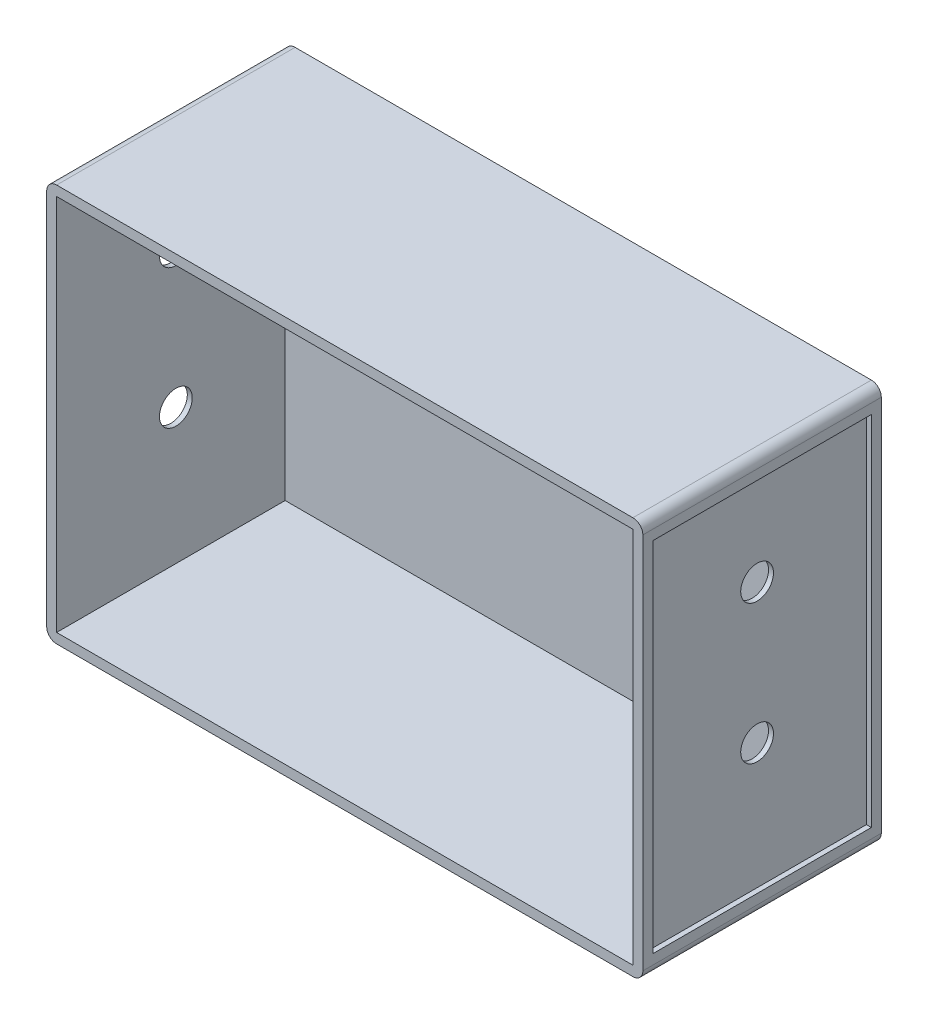
ISO-10303-21;
HEADER;
FILE_DESCRIPTION(('STEP AP214'),'2;1');
FILE_NAME('part.step','',(''),(''),'','','');
FILE_SCHEMA(('AUTOMOTIVE_DESIGN { 1 0 10303 214 1 1 1 1 }'));
ENDSEC;
DATA;
#1=APPLICATION_CONTEXT('core data for automotive mechanical design processes');
#2=APPLICATION_PROTOCOL_DEFINITION('international standard','automotive_design',2000,#1);
#3=PRODUCT_CONTEXT('',#1,'mechanical');
#4=PRODUCT('Part','Part','',(#3));
#5=PRODUCT_RELATED_PRODUCT_CATEGORY('part','',(#4));
#6=PRODUCT_DEFINITION_FORMATION('','',#4);
#7=PRODUCT_DEFINITION_CONTEXT('part definition',#1,'design');
#8=PRODUCT_DEFINITION('design','',#6,#7);
#9=PRODUCT_DEFINITION_SHAPE('','',#8);
#10=(LENGTH_UNIT() NAMED_UNIT(*) SI_UNIT(.MILLI.,.METRE.));
#11=(NAMED_UNIT(*) PLANE_ANGLE_UNIT() SI_UNIT($,.RADIAN.));
#12=(NAMED_UNIT(*) SI_UNIT($,.STERADIAN.) SOLID_ANGLE_UNIT());
#13=UNCERTAINTY_MEASURE_WITH_UNIT(LENGTH_MEASURE(1.E-05),#10,'distance_accuracy_value','');
#14=(GEOMETRIC_REPRESENTATION_CONTEXT(3) GLOBAL_UNCERTAINTY_ASSIGNED_CONTEXT((#13)) GLOBAL_UNIT_ASSIGNED_CONTEXT((#10,
#11,#12)) REPRESENTATION_CONTEXT('',''));
#15=CARTESIAN_POINT('',(0.,0.,0.));
#16=DIRECTION('',(0.,0.,1.));
#17=DIRECTION('',(1.,0.,0.));
#18=AXIS2_PLACEMENT_3D('',#15,#16,#17);
#19=CARTESIAN_POINT('',(150.,100.,60.));
#20=DIRECTION('',(-1.,0.,0.));
#21=DIRECTION('',(0.,-1.,0.));
#22=AXIS2_PLACEMENT_3D('',#19,#20,#21);
#23=PLANE('',#22);
#24=DIRECTION('',(0.,-1.,0.));
#25=VECTOR('',#24,1.);
#26=CARTESIAN_POINT('',(150.,90.,55.));
#27=LINE('',#26,#25);
#28=CARTESIAN_POINT('',(150.,90.,55.));
#29=VERTEX_POINT('',#28);
#30=CARTESIAN_POINT('',(150.,-90.,55.));
#31=VERTEX_POINT('',#30);
#32=EDGE_CURVE('E249',#29,#31,#27,.T.);
#33=ORIENTED_EDGE('',*,*,#32,.F.);
#34=DIRECTION('',(0.,0.,1.));
#35=VECTOR('',#34,1.);
#36=CARTESIAN_POINT('',(150.,90.,-55.));
#37=LINE('',#36,#35);
#38=CARTESIAN_POINT('',(150.,90.,-55.));
#39=VERTEX_POINT('',#38);
#40=EDGE_CURVE('E63',#39,#29,#37,.T.);
#41=ORIENTED_EDGE('',*,*,#40,.F.);
#42=DIRECTION('',(0.,1.,0.));
#43=VECTOR('',#42,1.);
#44=CARTESIAN_POINT('',(150.,-90.,-55.));
#45=LINE('',#44,#43);
#46=CARTESIAN_POINT('',(150.,-90.,-55.));
#47=VERTEX_POINT('',#46);
#48=EDGE_CURVE('E234',#47,#39,#45,.T.);
#49=ORIENTED_EDGE('',*,*,#48,.F.);
#50=DIRECTION('',(0.,0.,-1.));
#51=VECTOR('',#50,1.);
#52=CARTESIAN_POINT('',(150.,-90.,55.));
#53=LINE('',#52,#51);
#54=EDGE_CURVE('E253',#31,#47,#53,.T.);
#55=ORIENTED_EDGE('',*,*,#54,.F.);
#56=EDGE_LOOP('',(#33,#41,#49,#55));
#57=FACE_BOUND('',#56,.T.);
#58=DIRECTION('',(0.,1.,0.));
#59=VECTOR('',#58,1.);
#60=CARTESIAN_POINT('',(150.,100.,60.));
#61=LINE('',#60,#59);
#62=CARTESIAN_POINT('',(150.,-95.,60.));
#63=VERTEX_POINT('',#62);
#64=CARTESIAN_POINT('',(150.,95.,60.));
#65=VERTEX_POINT('',#64);
#66=EDGE_CURVE('E312',#63,#65,#61,.T.);
#67=ORIENTED_EDGE('',*,*,#66,.F.);
#68=DIRECTION('',(0.,0.,-1.));
#69=VECTOR('',#68,1.);
#70=CARTESIAN_POINT('',(150.,-95.,60.));
#71=LINE('',#70,#69);
#72=CARTESIAN_POINT('',(150.,-95.,-60.));
#73=VERTEX_POINT('',#72);
#74=EDGE_CURVE('E346',#63,#73,#71,.T.);
#75=ORIENTED_EDGE('',*,*,#74,.T.);
#76=DIRECTION('',(0.,1.,0.));
#77=VECTOR('',#76,1.);
#78=CARTESIAN_POINT('',(150.,100.,-60.));
#79=LINE('',#78,#77);
#80=CARTESIAN_POINT('',(150.,95.,-60.));
#81=VERTEX_POINT('',#80);
#82=EDGE_CURVE('E290',#73,#81,#79,.T.);
#83=ORIENTED_EDGE('',*,*,#82,.T.);
#84=DIRECTION('',(0.,0.,-1.));
#85=VECTOR('',#84,1.);
#86=CARTESIAN_POINT('',(150.,95.,60.));
#87=LINE('',#86,#85);
#88=EDGE_CURVE('E329',#81,#65,#87,.F.);
#89=ORIENTED_EDGE('',*,*,#88,.T.);
#90=EDGE_LOOP('',(#67,#75,#83,#89));
#91=FACE_BOUND('',#90,.T.);
#92=ADVANCED_FACE('F39',(#57,#91),#23,.F.);
#93=CARTESIAN_POINT('',(-150.,100.,60.));
#94=DIRECTION('',(0.,-1.,0.));
#95=DIRECTION('',(0.,0.,-1.));
#96=AXIS2_PLACEMENT_3D('',#93,#94,#95);
#97=PLANE('',#96);
#98=DIRECTION('',(-1.,0.,0.));
#99=VECTOR('',#98,1.);
#100=CARTESIAN_POINT('',(-150.,100.,-60.));
#101=LINE('',#100,#99);
#102=CARTESIAN_POINT('',(145.,100.,-60.));
#103=VERTEX_POINT('',#102);
#104=CARTESIAN_POINT('',(-145.,100.,-60.));
#105=VERTEX_POINT('',#104);
#106=EDGE_CURVE('E333',#103,#105,#101,.T.);
#107=ORIENTED_EDGE('',*,*,#106,.T.);
#108=DIRECTION('',(0.,0.,-1.));
#109=VECTOR('',#108,1.);
#110=CARTESIAN_POINT('',(-145.,100.,60.));
#111=LINE('',#110,#109);
#112=CARTESIAN_POINT('',(-145.,100.,60.));
#113=VERTEX_POINT('',#112);
#114=EDGE_CURVE('E11',#105,#113,#111,.F.);
#115=ORIENTED_EDGE('',*,*,#114,.T.);
#116=DIRECTION('',(-1.,0.,0.));
#117=VECTOR('',#116,1.);
#118=CARTESIAN_POINT('',(-150.,100.,60.));
#119=LINE('',#118,#117);
#120=CARTESIAN_POINT('',(145.,100.,60.));
#121=VERTEX_POINT('',#120);
#122=EDGE_CURVE('E316',#121,#113,#119,.T.);
#123=ORIENTED_EDGE('',*,*,#122,.F.);
#124=DIRECTION('',(0.,0.,-1.));
#125=VECTOR('',#124,1.);
#126=CARTESIAN_POINT('',(145.,100.,60.));
#127=LINE('',#126,#125);
#128=EDGE_CURVE('E48',#121,#103,#127,.T.);
#129=ORIENTED_EDGE('',*,*,#128,.T.);
#130=EDGE_LOOP('',(#107,#115,#123,#129));
#131=FACE_BOUND('',#130,.T.);
#132=ADVANCED_FACE('F393',(#131),#97,.F.);
#133=CARTESIAN_POINT('',(-150.,100.,60.));
#134=DIRECTION('',(1.,0.,0.));
#135=DIRECTION('',(0.,1.,0.));
#136=AXIS2_PLACEMENT_3D('',#133,#134,#135);
#137=PLANE('',#136);
#138=DIRECTION('',(0.,-1.,0.));
#139=VECTOR('',#138,1.);
#140=CARTESIAN_POINT('',(-150.,90.,-55.));
#141=LINE('',#140,#139);
#142=CARTESIAN_POINT('',(-150.,90.,-55.));
#143=VERTEX_POINT('',#142);
#144=CARTESIAN_POINT('',(-150.,-90.,-55.));
#145=VERTEX_POINT('',#144);
#146=EDGE_CURVE('E215',#143,#145,#141,.T.);
#147=ORIENTED_EDGE('',*,*,#146,.F.);
#148=DIRECTION('',(0.,0.,-1.));
#149=VECTOR('',#148,1.);
#150=CARTESIAN_POINT('',(-150.,90.,55.));
#151=LINE('',#150,#149);
#152=CARTESIAN_POINT('',(-150.,90.,55.));
#153=VERTEX_POINT('',#152);
#154=EDGE_CURVE('E55',#153,#143,#151,.T.);
#155=ORIENTED_EDGE('',*,*,#154,.F.);
#156=DIRECTION('',(0.,1.,0.));
#157=VECTOR('',#156,1.);
#158=CARTESIAN_POINT('',(-150.,-90.,55.));
#159=LINE('',#158,#157);
#160=CARTESIAN_POINT('',(-150.,-90.,55.));
#161=VERTEX_POINT('',#160);
#162=EDGE_CURVE('E199',#161,#153,#159,.T.);
#163=ORIENTED_EDGE('',*,*,#162,.F.);
#164=DIRECTION('',(0.,0.,1.));
#165=VECTOR('',#164,1.);
#166=CARTESIAN_POINT('',(-150.,-90.,-55.));
#167=LINE('',#166,#165);
#168=EDGE_CURVE('E203',#145,#161,#167,.T.);
#169=ORIENTED_EDGE('',*,*,#168,.F.);
#170=EDGE_LOOP('',(#147,#155,#163,#169));
#171=FACE_BOUND('',#170,.T.);
#172=DIRECTION('',(0.,-1.,0.));
#173=VECTOR('',#172,1.);
#174=CARTESIAN_POINT('',(-150.,100.,-60.));
#175=LINE('',#174,#173);
#176=CARTESIAN_POINT('',(-150.,95.,-60.));
#177=VERTEX_POINT('',#176);
#178=CARTESIAN_POINT('',(-150.,-95.,-60.));
#179=VERTEX_POINT('',#178);
#180=EDGE_CURVE('E337',#177,#179,#175,.T.);
#181=ORIENTED_EDGE('',*,*,#180,.T.);
#182=DIRECTION('',(0.,0.,-1.));
#183=VECTOR('',#182,1.);
#184=CARTESIAN_POINT('',(-150.,-95.,60.));
#185=LINE('',#184,#183);
#186=CARTESIAN_POINT('',(-150.,-95.,60.));
#187=VERTEX_POINT('',#186);
#188=EDGE_CURVE('E385',#179,#187,#185,.F.);
#189=ORIENTED_EDGE('',*,*,#188,.T.);
#190=DIRECTION('',(0.,-1.,0.));
#191=VECTOR('',#190,1.);
#192=CARTESIAN_POINT('',(-150.,100.,60.));
#193=LINE('',#192,#191);
#194=CARTESIAN_POINT('',(-150.,95.,60.));
#195=VERTEX_POINT('',#194);
#196=EDGE_CURVE('E321',#195,#187,#193,.T.);
#197=ORIENTED_EDGE('',*,*,#196,.F.);
#198=DIRECTION('',(0.,0.,-1.));
#199=VECTOR('',#198,1.);
#200=CARTESIAN_POINT('',(-150.,95.,60.));
#201=LINE('',#200,#199);
#202=EDGE_CURVE('E381',#195,#177,#201,.T.);
#203=ORIENTED_EDGE('',*,*,#202,.T.);
#204=EDGE_LOOP('',(#181,#189,#197,#203));
#205=FACE_BOUND('',#204,.T.);
#206=ADVANCED_FACE('F407',(#171,#205),#137,.F.);
#207=CARTESIAN_POINT('',(-150.,-100.,60.));
#208=DIRECTION('',(0.,1.,0.));
#209=DIRECTION('',(0.,0.,1.));
#210=AXIS2_PLACEMENT_3D('',#207,#208,#209);
#211=PLANE('',#210);
#212=DIRECTION('',(1.,0.,0.));
#213=VECTOR('',#212,1.);
#214=CARTESIAN_POINT('',(-150.,-100.,-60.));
#215=LINE('',#214,#213);
#216=CARTESIAN_POINT('',(-145.,-100.,-60.));
#217=VERTEX_POINT('',#216);
#218=CARTESIAN_POINT('',(145.,-100.,-60.));
#219=VERTEX_POINT('',#218);
#220=EDGE_CURVE('E317',#217,#219,#215,.T.);
#221=ORIENTED_EDGE('',*,*,#220,.T.);
#222=DIRECTION('',(0.,0.,-1.));
#223=VECTOR('',#222,1.);
#224=CARTESIAN_POINT('',(145.,-100.,60.));
#225=LINE('',#224,#223);
#226=CARTESIAN_POINT('',(145.,-100.,60.));
#227=VERTEX_POINT('',#226);
#228=EDGE_CURVE('E366',#219,#227,#225,.F.);
#229=ORIENTED_EDGE('',*,*,#228,.T.);
#230=DIRECTION('',(1.,0.,0.));
#231=VECTOR('',#230,1.);
#232=CARTESIAN_POINT('',(-150.,-100.,60.));
#233=LINE('',#232,#231);
#234=CARTESIAN_POINT('',(-145.,-100.,60.));
#235=VERTEX_POINT('',#234);
#236=EDGE_CURVE('E325',#235,#227,#233,.T.);
#237=ORIENTED_EDGE('',*,*,#236,.F.);
#238=DIRECTION('',(0.,0.,-1.));
#239=VECTOR('',#238,1.);
#240=CARTESIAN_POINT('',(-145.,-100.,60.));
#241=LINE('',#240,#239);
#242=EDGE_CURVE('E362',#235,#217,#241,.T.);
#243=ORIENTED_EDGE('',*,*,#242,.T.);
#244=EDGE_LOOP('',(#221,#229,#237,#243));
#245=FACE_BOUND('',#244,.T.);
#246=ADVANCED_FACE('F418',(#245),#211,.F.);
#247=CARTESIAN_POINT('',(0.,0.,60.));
#248=DIRECTION('',(0.,0.,1.));
#249=DIRECTION('',(1.,0.,0.));
#250=AXIS2_PLACEMENT_3D('',#247,#248,#249);
#251=PLANE('',#250);
#252=DIRECTION('',(1.,0.,0.));
#253=VECTOR('',#252,1.);
#254=CARTESIAN_POINT('',(-150.,-95.,60.));
#255=LINE('',#254,#253);
#256=CARTESIAN_POINT('',(-145.,-95.,60.));
#257=VERTEX_POINT('',#256);
#258=CARTESIAN_POINT('',(145.,-95.,60.));
#259=VERTEX_POINT('',#258);
#260=EDGE_CURVE('E282',#257,#259,#255,.T.);
#261=ORIENTED_EDGE('',*,*,#260,.F.);
#262=DIRECTION('',(0.,-1.,0.));
#263=VECTOR('',#262,1.);
#264=CARTESIAN_POINT('',(-145.,100.,60.));
#265=LINE('',#264,#263);
#266=CARTESIAN_POINT('',(-145.,95.,60.));
#267=VERTEX_POINT('',#266);
#268=EDGE_CURVE('E305',#267,#257,#265,.T.);
#269=ORIENTED_EDGE('',*,*,#268,.F.);
#270=DIRECTION('',(-1.,0.,0.));
#271=VECTOR('',#270,1.);
#272=CARTESIAN_POINT('',(-150.,95.,60.));
#273=LINE('',#272,#271);
#274=CARTESIAN_POINT('',(145.,95.,60.));
#275=VERTEX_POINT('',#274);
#276=EDGE_CURVE('E302',#275,#267,#273,.T.);
#277=ORIENTED_EDGE('',*,*,#276,.F.);
#278=DIRECTION('',(0.,1.,0.));
#279=VECTOR('',#278,1.);
#280=CARTESIAN_POINT('',(145.,100.,60.));
#281=LINE('',#280,#279);
#282=EDGE_CURVE('E298',#259,#275,#281,.T.);
#283=ORIENTED_EDGE('',*,*,#282,.F.);
#284=EDGE_LOOP('',(#261,#269,#277,#283));
#285=FACE_BOUND('',#284,.T.);
#286=ORIENTED_EDGE('',*,*,#236,.T.);
#287=CARTESIAN_POINT('',(145.,-95.,60.));
#288=DIRECTION('',(0.,0.,1.));
#289=DIRECTION('',(1.,0.,0.));
#290=AXIS2_PLACEMENT_3D('',#287,#288,#289);
#291=CIRCLE('',#290,5.);
#292=EDGE_CURVE('E378',#227,#63,#291,.T.);
#293=ORIENTED_EDGE('',*,*,#292,.T.);
#294=ORIENTED_EDGE('',*,*,#66,.T.);
#295=CARTESIAN_POINT('',(145.,95.,60.));
#296=DIRECTION('',(0.,0.,1.));
#297=DIRECTION('',(1.,0.,0.));
#298=AXIS2_PLACEMENT_3D('',#295,#296,#297);
#299=CIRCLE('',#298,5.);
#300=EDGE_CURVE('E369',#65,#121,#299,.T.);
#301=ORIENTED_EDGE('',*,*,#300,.T.);
#302=ORIENTED_EDGE('',*,*,#122,.T.);
#303=CARTESIAN_POINT('',(-145.,95.,60.));
#304=DIRECTION('',(0.,0.,1.));
#305=DIRECTION('',(1.,0.,0.));
#306=AXIS2_PLACEMENT_3D('',#303,#304,#305);
#307=CIRCLE('',#306,5.);
#308=EDGE_CURVE('E372',#113,#195,#307,.T.);
#309=ORIENTED_EDGE('',*,*,#308,.T.);
#310=ORIENTED_EDGE('',*,*,#196,.T.);
#311=CARTESIAN_POINT('',(-145.,-95.,60.));
#312=DIRECTION('',(0.,0.,1.));
#313=DIRECTION('',(1.,0.,0.));
#314=AXIS2_PLACEMENT_3D('',#311,#312,#313);
#315=CIRCLE('',#314,5.);
#316=EDGE_CURVE('E375',#187,#235,#315,.T.);
#317=ORIENTED_EDGE('',*,*,#316,.T.);
#318=EDGE_LOOP('',(#286,#293,#294,#301,#302,#309,#310,#317));
#319=FACE_BOUND('',#318,.T.);
#320=ADVANCED_FACE('F411',(#285,#319),#251,.T.);
#321=CARTESIAN_POINT('',(0.,0.,-60.));
#322=DIRECTION('',(0.,0.,1.));
#323=DIRECTION('',(1.,0.,0.));
#324=AXIS2_PLACEMENT_3D('',#321,#322,#323);
#325=PLANE('',#324);
#326=ORIENTED_EDGE('',*,*,#82,.F.);
#327=CARTESIAN_POINT('',(145.,-95.,-60.));
#328=DIRECTION('',(0.,0.,1.));
#329=DIRECTION('',(1.,0.,0.));
#330=AXIS2_PLACEMENT_3D('',#327,#328,#329);
#331=CIRCLE('',#330,5.);
#332=EDGE_CURVE('E359',#73,#219,#331,.F.);
#333=ORIENTED_EDGE('',*,*,#332,.T.);
#334=ORIENTED_EDGE('',*,*,#220,.F.);
#335=CARTESIAN_POINT('',(-145.,-95.,-60.));
#336=DIRECTION('',(0.,0.,1.));
#337=DIRECTION('',(1.,0.,0.));
#338=AXIS2_PLACEMENT_3D('',#335,#336,#337);
#339=CIRCLE('',#338,5.);
#340=EDGE_CURVE('E356',#217,#179,#339,.F.);
#341=ORIENTED_EDGE('',*,*,#340,.T.);
#342=ORIENTED_EDGE('',*,*,#180,.F.);
#343=CARTESIAN_POINT('',(-145.,95.,-60.));
#344=DIRECTION('',(0.,0.,1.));
#345=DIRECTION('',(1.,0.,0.));
#346=AXIS2_PLACEMENT_3D('',#343,#344,#345);
#347=CIRCLE('',#346,5.);
#348=EDGE_CURVE('E353',#177,#105,#347,.F.);
#349=ORIENTED_EDGE('',*,*,#348,.T.);
#350=ORIENTED_EDGE('',*,*,#106,.F.);
#351=CARTESIAN_POINT('',(145.,95.,-60.));
#352=DIRECTION('',(0.,0.,1.));
#353=DIRECTION('',(1.,0.,0.));
#354=AXIS2_PLACEMENT_3D('',#351,#352,#353);
#355=CIRCLE('',#354,5.);
#356=EDGE_CURVE('E350',#103,#81,#355,.F.);
#357=ORIENTED_EDGE('',*,*,#356,.T.);
#358=EDGE_LOOP('',(#326,#333,#334,#341,#342,#349,#350,#357));
#359=FACE_BOUND('',#358,.T.);
#360=ADVANCED_FACE('F399',(#359),#325,.F.);
#361=CARTESIAN_POINT('',(145.,-95.,60.));
#362=DIRECTION('',(0.,0.,-1.));
#363=DIRECTION('',(-1.,0.,0.));
#364=AXIS2_PLACEMENT_3D('',#361,#362,#363);
#365=CYLINDRICAL_SURFACE('',#364,5.);
#366=ORIENTED_EDGE('',*,*,#292,.F.);
#367=ORIENTED_EDGE('',*,*,#228,.F.);
#368=ORIENTED_EDGE('',*,*,#332,.F.);
#369=ORIENTED_EDGE('',*,*,#74,.F.);
#370=EDGE_LOOP('',(#366,#367,#368,#369));
#371=FACE_BOUND('',#370,.T.);
#372=ADVANCED_FACE('F423',(#371),#365,.T.);
#373=CARTESIAN_POINT('',(-145.,-95.,60.));
#374=DIRECTION('',(0.,0.,-1.));
#375=DIRECTION('',(-1.,0.,0.));
#376=AXIS2_PLACEMENT_3D('',#373,#374,#375);
#377=CYLINDRICAL_SURFACE('',#376,5.);
#378=ORIENTED_EDGE('',*,*,#316,.F.);
#379=ORIENTED_EDGE('',*,*,#188,.F.);
#380=ORIENTED_EDGE('',*,*,#340,.F.);
#381=ORIENTED_EDGE('',*,*,#242,.F.);
#382=EDGE_LOOP('',(#378,#379,#380,#381));
#383=FACE_BOUND('',#382,.T.);
#384=ADVANCED_FACE('F415',(#383),#377,.T.);
#385=CARTESIAN_POINT('',(-145.,95.,60.));
#386=DIRECTION('',(0.,0.,-1.));
#387=DIRECTION('',(-1.,0.,0.));
#388=AXIS2_PLACEMENT_3D('',#385,#386,#387);
#389=CYLINDRICAL_SURFACE('',#388,5.);
#390=ORIENTED_EDGE('',*,*,#308,.F.);
#391=ORIENTED_EDGE('',*,*,#114,.F.);
#392=ORIENTED_EDGE('',*,*,#348,.F.);
#393=ORIENTED_EDGE('',*,*,#202,.F.);
#394=EDGE_LOOP('',(#390,#391,#392,#393));
#395=FACE_BOUND('',#394,.T.);
#396=ADVANCED_FACE('F404',(#395),#389,.T.);
#397=CARTESIAN_POINT('',(145.,95.,60.));
#398=DIRECTION('',(0.,0.,-1.));
#399=DIRECTION('',(-1.,0.,0.));
#400=AXIS2_PLACEMENT_3D('',#397,#398,#399);
#401=CYLINDRICAL_SURFACE('',#400,5.);
#402=ORIENTED_EDGE('',*,*,#300,.F.);
#403=ORIENTED_EDGE('',*,*,#88,.F.);
#404=ORIENTED_EDGE('',*,*,#356,.F.);
#405=ORIENTED_EDGE('',*,*,#128,.F.);
#406=EDGE_LOOP('',(#402,#403,#404,#405));
#407=FACE_BOUND('',#406,.T.);
#408=ADVANCED_FACE('F41',(#407),#401,.T.);
#409=CARTESIAN_POINT('',(145.,100.,60.));
#410=DIRECTION('',(-1.,0.,0.));
#411=DIRECTION('',(0.,-1.,0.));
#412=AXIS2_PLACEMENT_3D('',#409,#410,#411);
#413=PLANE('',#412);
#414=CARTESIAN_POINT('',(145.,43.1552997098791,0.));
#415=DIRECTION('',(-1.,0.,0.));
#416=DIRECTION('',(0.,-1.,0.));
#417=AXIS2_PLACEMENT_3D('',#414,#415,#416);
#418=CIRCLE('',#417,8.25);
#419=CARTESIAN_POINT('',(145.,34.9052997098791,0.));
#420=VERTEX_POINT('',#419);
#421=EDGE_CURVE('E206',#420,#420,#418,.T.);
#422=ORIENTED_EDGE('',*,*,#421,.F.);
#423=EDGE_LOOP('',(#422));
#424=FACE_BOUND('',#423,.T.);
#425=CARTESIAN_POINT('',(145.,-26.8447002901209,0.));
#426=DIRECTION('',(-1.,0.,0.));
#427=DIRECTION('',(0.,-1.,0.));
#428=AXIS2_PLACEMENT_3D('',#425,#426,#427);
#429=CIRCLE('',#428,8.25);
#430=CARTESIAN_POINT('',(145.,-35.0947002901209,0.));
#431=VERTEX_POINT('',#430);
#432=EDGE_CURVE('E699',#431,#431,#429,.T.);
#433=ORIENTED_EDGE('',*,*,#432,.F.);
#434=EDGE_LOOP('',(#433));
#435=FACE_BOUND('',#434,.T.);
#436=ORIENTED_EDGE('',*,*,#282,.T.);
#437=DIRECTION('',(0.,0.,1.));
#438=VECTOR('',#437,1.);
#439=CARTESIAN_POINT('',(145.,95.,60.));
#440=LINE('',#439,#438);
#441=CARTESIAN_POINT('',(145.,95.,-55.));
#442=VERTEX_POINT('',#441);
#443=EDGE_CURVE('E276',#442,#275,#440,.T.);
#444=ORIENTED_EDGE('',*,*,#443,.F.);
#445=DIRECTION('',(0.,1.,0.));
#446=VECTOR('',#445,1.);
#447=CARTESIAN_POINT('',(145.,100.,-55.));
#448=LINE('',#447,#446);
#449=CARTESIAN_POINT('',(145.,-95.,-55.));
#450=VERTEX_POINT('',#449);
#451=EDGE_CURVE('E263',#450,#442,#448,.T.);
#452=ORIENTED_EDGE('',*,*,#451,.F.);
#453=DIRECTION('',(0.,0.,1.));
#454=VECTOR('',#453,1.);
#455=CARTESIAN_POINT('',(145.,-95.,60.));
#456=LINE('',#455,#454);
#457=EDGE_CURVE('E272',#450,#259,#456,.T.);
#458=ORIENTED_EDGE('',*,*,#457,.T.);
#459=EDGE_LOOP('',(#436,#444,#452,#458));
#460=FACE_BOUND('',#459,.T.);
#461=ADVANCED_FACE('F428',(#424,#435,#460),#413,.T.);
#462=CARTESIAN_POINT('',(-150.,95.,60.));
#463=DIRECTION('',(0.,-1.,0.));
#464=DIRECTION('',(0.,0.,-1.));
#465=AXIS2_PLACEMENT_3D('',#462,#463,#464);
#466=PLANE('',#465);
#467=DIRECTION('',(-1.,0.,0.));
#468=VECTOR('',#467,1.);
#469=CARTESIAN_POINT('',(-150.,95.,-55.));
#470=LINE('',#469,#468);
#471=CARTESIAN_POINT('',(-145.,95.,-55.));
#472=VERTEX_POINT('',#471);
#473=EDGE_CURVE('E279',#442,#472,#470,.T.);
#474=ORIENTED_EDGE('',*,*,#473,.F.);
#475=ORIENTED_EDGE('',*,*,#443,.T.);
#476=ORIENTED_EDGE('',*,*,#276,.T.);
#477=DIRECTION('',(0.,0.,1.));
#478=VECTOR('',#477,1.);
#479=CARTESIAN_POINT('',(-145.,95.,60.));
#480=LINE('',#479,#478);
#481=EDGE_CURVE('E286',#472,#267,#480,.T.);
#482=ORIENTED_EDGE('',*,*,#481,.F.);
#483=EDGE_LOOP('',(#474,#475,#476,#482));
#484=FACE_BOUND('',#483,.T.);
#485=ADVANCED_FACE('F433',(#484),#466,.T.);
#486=CARTESIAN_POINT('',(-145.,100.,60.));
#487=DIRECTION('',(1.,0.,0.));
#488=DIRECTION('',(0.,1.,0.));
#489=AXIS2_PLACEMENT_3D('',#486,#487,#488);
#490=PLANE('',#489);
#491=CARTESIAN_POINT('',(-145.,43.1552997098791,0.));
#492=DIRECTION('',(1.,0.,0.));
#493=DIRECTION('',(0.,1.,0.));
#494=AXIS2_PLACEMENT_3D('',#491,#492,#493);
#495=CIRCLE('',#494,8.25);
#496=CARTESIAN_POINT('',(-145.,51.4052997098791,0.));
#497=VERTEX_POINT('',#496);
#498=EDGE_CURVE('E698',#497,#497,#495,.T.);
#499=ORIENTED_EDGE('',*,*,#498,.F.);
#500=EDGE_LOOP('',(#499));
#501=FACE_BOUND('',#500,.T.);
#502=CARTESIAN_POINT('',(-145.,-26.8447002901209,0.));
#503=DIRECTION('',(1.,0.,0.));
#504=DIRECTION('',(0.,1.,0.));
#505=AXIS2_PLACEMENT_3D('',#502,#503,#504);
#506=CIRCLE('',#505,8.25);
#507=CARTESIAN_POINT('',(-145.,-18.5947002901209,0.));
#508=VERTEX_POINT('',#507);
#509=EDGE_CURVE('E705',#508,#508,#506,.T.);
#510=ORIENTED_EDGE('',*,*,#509,.F.);
#511=EDGE_LOOP('',(#510));
#512=FACE_BOUND('',#511,.T.);
#513=DIRECTION('',(0.,-1.,0.));
#514=VECTOR('',#513,1.);
#515=CARTESIAN_POINT('',(-145.,100.,-55.));
#516=LINE('',#515,#514);
#517=CARTESIAN_POINT('',(-145.,-95.,-55.));
#518=VERTEX_POINT('',#517);
#519=EDGE_CURVE('E285',#472,#518,#516,.T.);
#520=ORIENTED_EDGE('',*,*,#519,.F.);
#521=ORIENTED_EDGE('',*,*,#481,.T.);
#522=ORIENTED_EDGE('',*,*,#268,.T.);
#523=DIRECTION('',(0.,0.,1.));
#524=VECTOR('',#523,1.);
#525=CARTESIAN_POINT('',(-145.,-95.,60.));
#526=LINE('',#525,#524);
#527=EDGE_CURVE('E275',#518,#257,#526,.T.);
#528=ORIENTED_EDGE('',*,*,#527,.F.);
#529=EDGE_LOOP('',(#520,#521,#522,#528));
#530=FACE_BOUND('',#529,.T.);
#531=ADVANCED_FACE('F484',(#501,#512,#530),#490,.T.);
#532=CARTESIAN_POINT('',(-150.,-95.,60.));
#533=DIRECTION('',(0.,1.,0.));
#534=DIRECTION('',(0.,0.,1.));
#535=AXIS2_PLACEMENT_3D('',#532,#533,#534);
#536=PLANE('',#535);
#537=DIRECTION('',(1.,0.,0.));
#538=VECTOR('',#537,1.);
#539=CARTESIAN_POINT('',(-150.,-95.,-55.));
#540=LINE('',#539,#538);
#541=EDGE_CURVE('E293',#518,#450,#540,.T.);
#542=ORIENTED_EDGE('',*,*,#541,.F.);
#543=ORIENTED_EDGE('',*,*,#527,.T.);
#544=ORIENTED_EDGE('',*,*,#260,.T.);
#545=ORIENTED_EDGE('',*,*,#457,.F.);
#546=EDGE_LOOP('',(#542,#543,#544,#545));
#547=FACE_BOUND('',#546,.T.);
#548=ADVANCED_FACE('F492',(#547),#536,.T.);
#549=CARTESIAN_POINT('',(0.,0.,-55.));
#550=DIRECTION('',(0.,0.,1.));
#551=DIRECTION('',(1.,0.,0.));
#552=AXIS2_PLACEMENT_3D('',#549,#550,#551);
#553=PLANE('',#552);
#554=ORIENTED_EDGE('',*,*,#451,.T.);
#555=ORIENTED_EDGE('',*,*,#473,.T.);
#556=ORIENTED_EDGE('',*,*,#519,.T.);
#557=ORIENTED_EDGE('',*,*,#541,.T.);
#558=EDGE_LOOP('',(#554,#555,#556,#557));
#559=FACE_BOUND('',#558,.T.);
#560=ADVANCED_FACE('F497',(#559),#553,.T.);
#561=CARTESIAN_POINT('',(147.5,90.,-55.));
#562=DIRECTION('',(0.,1.,0.));
#563=DIRECTION('',(-1.,0.,0.));
#564=AXIS2_PLACEMENT_3D('',#561,#562,#563);
#565=PLANE('',#564);
#566=ORIENTED_EDGE('',*,*,#40,.T.);
#567=DIRECTION('',(1.,0.,0.));
#568=VECTOR('',#567,1.);
#569=CARTESIAN_POINT('',(147.5,90.,55.));
#570=LINE('',#569,#568);
#571=CARTESIAN_POINT('',(147.5,90.,55.));
#572=VERTEX_POINT('',#571);
#573=EDGE_CURVE('E246',#572,#29,#570,.T.);
#574=ORIENTED_EDGE('',*,*,#573,.F.);
#575=DIRECTION('',(0.,0.,1.));
#576=VECTOR('',#575,1.);
#577=CARTESIAN_POINT('',(147.5,90.,-55.));
#578=LINE('',#577,#576);
#579=CARTESIAN_POINT('',(147.5,90.,-55.));
#580=VERTEX_POINT('',#579);
#581=EDGE_CURVE('E229',#580,#572,#578,.T.);
#582=ORIENTED_EDGE('',*,*,#581,.F.);
#583=DIRECTION('',(1.,0.,0.));
#584=VECTOR('',#583,1.);
#585=CARTESIAN_POINT('',(147.5,90.,-55.));
#586=LINE('',#585,#584);
#587=EDGE_CURVE('E260',#580,#39,#586,.T.);
#588=ORIENTED_EDGE('',*,*,#587,.T.);
#589=EDGE_LOOP('',(#566,#574,#582,#588));
#590=FACE_BOUND('',#589,.T.);
#591=ADVANCED_FACE('F506',(#590),#565,.F.);
#592=CARTESIAN_POINT('',(147.5,-90.,-55.));
#593=DIRECTION('',(0.,0.,-1.));
#594=DIRECTION('',(-1.,0.,0.));
#595=AXIS2_PLACEMENT_3D('',#592,#593,#594);
#596=PLANE('',#595);
#597=ORIENTED_EDGE('',*,*,#48,.T.);
#598=ORIENTED_EDGE('',*,*,#587,.F.);
#599=DIRECTION('',(0.,1.,0.));
#600=VECTOR('',#599,1.);
#601=CARTESIAN_POINT('',(147.5,-90.,-55.));
#602=LINE('',#601,#600);
#603=CARTESIAN_POINT('',(147.5,-90.,-55.));
#604=VERTEX_POINT('',#603);
#605=EDGE_CURVE('E242',#604,#580,#602,.T.);
#606=ORIENTED_EDGE('',*,*,#605,.F.);
#607=DIRECTION('',(1.,0.,0.));
#608=VECTOR('',#607,1.);
#609=CARTESIAN_POINT('',(147.5,-90.,-55.));
#610=LINE('',#609,#608);
#611=EDGE_CURVE('E264',#604,#47,#610,.T.);
#612=ORIENTED_EDGE('',*,*,#611,.T.);
#613=EDGE_LOOP('',(#597,#598,#606,#612));
#614=FACE_BOUND('',#613,.T.);
#615=ADVANCED_FACE('F522',(#614),#596,.F.);
#616=CARTESIAN_POINT('',(147.5,-90.,55.));
#617=DIRECTION('',(0.,-1.,0.));
#618=DIRECTION('',(1.,0.,0.));
#619=AXIS2_PLACEMENT_3D('',#616,#617,#618);
#620=PLANE('',#619);
#621=ORIENTED_EDGE('',*,*,#54,.T.);
#622=ORIENTED_EDGE('',*,*,#611,.F.);
#623=DIRECTION('',(0.,0.,-1.));
#624=VECTOR('',#623,1.);
#625=CARTESIAN_POINT('',(147.5,-90.,55.));
#626=LINE('',#625,#624);
#627=CARTESIAN_POINT('',(147.5,-90.,55.));
#628=VERTEX_POINT('',#627);
#629=EDGE_CURVE('E238',#628,#604,#626,.T.);
#630=ORIENTED_EDGE('',*,*,#629,.F.);
#631=DIRECTION('',(1.,0.,0.));
#632=VECTOR('',#631,1.);
#633=CARTESIAN_POINT('',(147.5,-90.,55.));
#634=LINE('',#633,#632);
#635=EDGE_CURVE('E267',#628,#31,#634,.T.);
#636=ORIENTED_EDGE('',*,*,#635,.T.);
#637=EDGE_LOOP('',(#621,#622,#630,#636));
#638=FACE_BOUND('',#637,.T.);
#639=ADVANCED_FACE('F531',(#638),#620,.F.);
#640=CARTESIAN_POINT('',(147.5,90.,55.));
#641=DIRECTION('',(0.,0.,1.));
#642=DIRECTION('',(1.,0.,0.));
#643=AXIS2_PLACEMENT_3D('',#640,#641,#642);
#644=PLANE('',#643);
#645=ORIENTED_EDGE('',*,*,#32,.T.);
#646=ORIENTED_EDGE('',*,*,#635,.F.);
#647=DIRECTION('',(0.,-1.,0.));
#648=VECTOR('',#647,1.);
#649=CARTESIAN_POINT('',(147.5,90.,55.));
#650=LINE('',#649,#648);
#651=EDGE_CURVE('E233',#572,#628,#650,.T.);
#652=ORIENTED_EDGE('',*,*,#651,.F.);
#653=ORIENTED_EDGE('',*,*,#573,.T.);
#654=EDGE_LOOP('',(#645,#646,#652,#653));
#655=FACE_BOUND('',#654,.T.);
#656=ADVANCED_FACE('F541',(#655),#644,.F.);
#657=CARTESIAN_POINT('',(147.5,0.,0.));
#658=DIRECTION('',(1.,0.,0.));
#659=DIRECTION('',(0.,0.,-1.));
#660=AXIS2_PLACEMENT_3D('',#657,#658,#659);
#661=PLANE('',#660);
#662=CARTESIAN_POINT('',(147.5,43.1552997098791,0.));
#663=DIRECTION('',(1.,0.,0.));
#664=DIRECTION('',(0.,0.,-1.));
#665=AXIS2_PLACEMENT_3D('',#662,#663,#664);
#666=CIRCLE('',#665,8.25);
#667=CARTESIAN_POINT('',(147.5,43.1552997098791,-8.24999999999999));
#668=VERTEX_POINT('',#667);
#669=EDGE_CURVE('E696',#668,#668,#666,.T.);
#670=ORIENTED_EDGE('',*,*,#669,.F.);
#671=EDGE_LOOP('',(#670));
#672=FACE_BOUND('',#671,.T.);
#673=CARTESIAN_POINT('',(147.5,-26.8447002901209,0.));
#674=DIRECTION('',(1.,0.,0.));
#675=DIRECTION('',(0.,0.,-1.));
#676=AXIS2_PLACEMENT_3D('',#673,#674,#675);
#677=CIRCLE('',#676,8.25);
#678=CARTESIAN_POINT('',(147.5,-26.8447002901209,-8.25));
#679=VERTEX_POINT('',#678);
#680=EDGE_CURVE('E711',#679,#679,#677,.T.);
#681=ORIENTED_EDGE('',*,*,#680,.F.);
#682=EDGE_LOOP('',(#681));
#683=FACE_BOUND('',#682,.T.);
#684=ORIENTED_EDGE('',*,*,#581,.T.);
#685=ORIENTED_EDGE('',*,*,#651,.T.);
#686=ORIENTED_EDGE('',*,*,#629,.T.);
#687=ORIENTED_EDGE('',*,*,#605,.T.);
#688=EDGE_LOOP('',(#684,#685,#686,#687));
#689=FACE_BOUND('',#688,.T.);
#690=ADVANCED_FACE('F551',(#672,#683,#689),#661,.T.);
#691=CARTESIAN_POINT('',(-147.5,90.,55.));
#692=DIRECTION('',(0.,1.,0.));
#693=DIRECTION('',(0.,0.,1.));
#694=AXIS2_PLACEMENT_3D('',#691,#692,#693);
#695=PLANE('',#694);
#696=ORIENTED_EDGE('',*,*,#154,.T.);
#697=DIRECTION('',(-1.,0.,0.));
#698=VECTOR('',#697,1.);
#699=CARTESIAN_POINT('',(-147.5,90.,-55.));
#700=LINE('',#699,#698);
#701=CARTESIAN_POINT('',(-147.5,90.,-55.));
#702=VERTEX_POINT('',#701);
#703=EDGE_CURVE('E174',#702,#143,#700,.T.);
#704=ORIENTED_EDGE('',*,*,#703,.F.);
#705=DIRECTION('',(0.,0.,-1.));
#706=VECTOR('',#705,1.);
#707=CARTESIAN_POINT('',(-147.5,90.,55.));
#708=LINE('',#707,#706);
#709=CARTESIAN_POINT('',(-147.5,90.,55.));
#710=VERTEX_POINT('',#709);
#711=EDGE_CURVE('E178',#710,#702,#708,.T.);
#712=ORIENTED_EDGE('',*,*,#711,.F.);
#713=DIRECTION('',(-1.,0.,0.));
#714=VECTOR('',#713,1.);
#715=CARTESIAN_POINT('',(-147.5,90.,55.));
#716=LINE('',#715,#714);
#717=EDGE_CURVE('E221',#710,#153,#716,.T.);
#718=ORIENTED_EDGE('',*,*,#717,.T.);
#719=EDGE_LOOP('',(#696,#704,#712,#718));
#720=FACE_BOUND('',#719,.T.);
#721=ADVANCED_FACE('F176',(#720),#695,.F.);
#722=CARTESIAN_POINT('',(-147.5,-90.,55.));
#723=DIRECTION('',(0.,0.,1.));
#724=DIRECTION('',(1.,0.,0.));
#725=AXIS2_PLACEMENT_3D('',#722,#723,#724);
#726=PLANE('',#725);
#727=ORIENTED_EDGE('',*,*,#162,.T.);
#728=ORIENTED_EDGE('',*,*,#717,.F.);
#729=DIRECTION('',(0.,1.,0.));
#730=VECTOR('',#729,1.);
#731=CARTESIAN_POINT('',(-147.5,-90.,55.));
#732=LINE('',#731,#730);
#733=CARTESIAN_POINT('',(-147.5,-90.,55.));
#734=VERTEX_POINT('',#733);
#735=EDGE_CURVE('E185',#734,#710,#732,.T.);
#736=ORIENTED_EDGE('',*,*,#735,.F.);
#737=DIRECTION('',(-1.,0.,0.));
#738=VECTOR('',#737,1.);
#739=CARTESIAN_POINT('',(-147.5,-90.,55.));
#740=LINE('',#739,#738);
#741=EDGE_CURVE('E224',#734,#161,#740,.T.);
#742=ORIENTED_EDGE('',*,*,#741,.T.);
#743=EDGE_LOOP('',(#727,#728,#736,#742));
#744=FACE_BOUND('',#743,.T.);
#745=ADVANCED_FACE('F571',(#744),#726,.F.);
#746=CARTESIAN_POINT('',(-147.5,-90.,-55.));
#747=DIRECTION('',(0.,-1.,0.));
#748=DIRECTION('',(0.,0.,-1.));
#749=AXIS2_PLACEMENT_3D('',#746,#747,#748);
#750=PLANE('',#749);
#751=ORIENTED_EDGE('',*,*,#168,.T.);
#752=ORIENTED_EDGE('',*,*,#741,.F.);
#753=DIRECTION('',(0.,0.,1.));
#754=VECTOR('',#753,1.);
#755=CARTESIAN_POINT('',(-147.5,-90.,-55.));
#756=LINE('',#755,#754);
#757=CARTESIAN_POINT('',(-147.5,-90.,-55.));
#758=VERTEX_POINT('',#757);
#759=EDGE_CURVE('E194',#758,#734,#756,.T.);
#760=ORIENTED_EDGE('',*,*,#759,.F.);
#761=DIRECTION('',(-1.,0.,0.));
#762=VECTOR('',#761,1.);
#763=CARTESIAN_POINT('',(-147.5,-90.,-55.));
#764=LINE('',#763,#762);
#765=EDGE_CURVE('E184',#758,#145,#764,.T.);
#766=ORIENTED_EDGE('',*,*,#765,.T.);
#767=EDGE_LOOP('',(#751,#752,#760,#766));
#768=FACE_BOUND('',#767,.T.);
#769=ADVANCED_FACE('F580',(#768),#750,.F.);
#770=CARTESIAN_POINT('',(-147.5,90.,-55.));
#771=DIRECTION('',(0.,0.,-1.));
#772=DIRECTION('',(-1.,0.,0.));
#773=AXIS2_PLACEMENT_3D('',#770,#771,#772);
#774=PLANE('',#773);
#775=ORIENTED_EDGE('',*,*,#146,.T.);
#776=ORIENTED_EDGE('',*,*,#765,.F.);
#777=DIRECTION('',(0.,-1.,0.));
#778=VECTOR('',#777,1.);
#779=CARTESIAN_POINT('',(-147.5,90.,-55.));
#780=LINE('',#779,#778);
#781=EDGE_CURVE('E188',#702,#758,#780,.T.);
#782=ORIENTED_EDGE('',*,*,#781,.F.);
#783=ORIENTED_EDGE('',*,*,#703,.T.);
#784=EDGE_LOOP('',(#775,#776,#782,#783));
#785=FACE_BOUND('',#784,.T.);
#786=ADVANCED_FACE('F189',(#785),#774,.F.);
#787=CARTESIAN_POINT('',(-147.5,0.,0.));
#788=DIRECTION('',(-1.,0.,0.));
#789=DIRECTION('',(0.,0.,1.));
#790=AXIS2_PLACEMENT_3D('',#787,#788,#789);
#791=PLANE('',#790);
#792=CARTESIAN_POINT('',(-147.5,43.1552997098791,0.));
#793=DIRECTION('',(-1.,0.,0.));
#794=DIRECTION('',(0.,0.,1.));
#795=AXIS2_PLACEMENT_3D('',#792,#793,#794);
#796=CIRCLE('',#795,8.25);
#797=CARTESIAN_POINT('',(-147.5,43.1552997098791,8.25000000000001));
#798=VERTEX_POINT('',#797);
#799=EDGE_CURVE('E715',#798,#798,#796,.T.);
#800=ORIENTED_EDGE('',*,*,#799,.F.);
#801=EDGE_LOOP('',(#800));
#802=FACE_BOUND('',#801,.T.);
#803=CARTESIAN_POINT('',(-147.5,-26.8447002901209,0.));
#804=DIRECTION('',(-1.,0.,0.));
#805=DIRECTION('',(0.,0.,1.));
#806=AXIS2_PLACEMENT_3D('',#803,#804,#805);
#807=CIRCLE('',#806,8.25);
#808=CARTESIAN_POINT('',(-147.5,-26.8447002901209,8.25));
#809=VERTEX_POINT('',#808);
#810=EDGE_CURVE('E716',#809,#809,#807,.T.);
#811=ORIENTED_EDGE('',*,*,#810,.F.);
#812=EDGE_LOOP('',(#811));
#813=FACE_BOUND('',#812,.T.);
#814=ORIENTED_EDGE('',*,*,#711,.T.);
#815=ORIENTED_EDGE('',*,*,#781,.T.);
#816=ORIENTED_EDGE('',*,*,#759,.T.);
#817=ORIENTED_EDGE('',*,*,#735,.T.);
#818=EDGE_LOOP('',(#814,#815,#816,#817));
#819=FACE_BOUND('',#818,.T.);
#820=ADVANCED_FACE('F196',(#802,#813,#819),#791,.T.);
#821=CARTESIAN_POINT('',(150.,-26.8447002901209,0.));
#822=DIRECTION('',(-1.,0.,0.));
#823=DIRECTION('',(0.,0.,1.));
#824=AXIS2_PLACEMENT_3D('',#821,#822,#823);
#825=CYLINDRICAL_SURFACE('',#824,8.25);
#826=ORIENTED_EDGE('',*,*,#509,.T.);
#827=EDGE_LOOP('',(#826));
#828=FACE_BOUND('',#827,.T.);
#829=ORIENTED_EDGE('',*,*,#810,.T.);
#830=EDGE_LOOP('',(#829));
#831=FACE_BOUND('',#830,.T.);
#832=ADVANCED_FACE('F626',(#828,#831),#825,.F.);
#833=CARTESIAN_POINT('',(150.,43.1552997098791,0.));
#834=DIRECTION('',(-1.,0.,0.));
#835=DIRECTION('',(0.,0.,1.));
#836=AXIS2_PLACEMENT_3D('',#833,#834,#835);
#837=CYLINDRICAL_SURFACE('',#836,8.25);
#838=ORIENTED_EDGE('',*,*,#498,.T.);
#839=EDGE_LOOP('',(#838));
#840=FACE_BOUND('',#839,.T.);
#841=ORIENTED_EDGE('',*,*,#799,.T.);
#842=EDGE_LOOP('',(#841));
#843=FACE_BOUND('',#842,.T.);
#844=ADVANCED_FACE('F636',(#840,#843),#837,.F.);
#845=ORIENTED_EDGE('',*,*,#432,.T.);
#846=EDGE_LOOP('',(#845));
#847=FACE_BOUND('',#846,.T.);
#848=ORIENTED_EDGE('',*,*,#680,.T.);
#849=EDGE_LOOP('',(#848));
#850=FACE_BOUND('',#849,.T.);
#851=ADVANCED_FACE('F639',(#847,#850),#825,.F.);
#852=ORIENTED_EDGE('',*,*,#421,.T.);
#853=EDGE_LOOP('',(#852));
#854=FACE_BOUND('',#853,.T.);
#855=ORIENTED_EDGE('',*,*,#669,.T.);
#856=EDGE_LOOP('',(#855));
#857=FACE_BOUND('',#856,.T.);
#858=ADVANCED_FACE('F649',(#854,#857),#837,.F.);
#859=CLOSED_SHELL('',(#92,#132,#206,#246,#320,#360,#372,#384,#396,#408,#461,#485,#531,#548,#560,
#591,#615,#639,#656,#690,#721,#745,#769,#786,#820,#832,#844,#851,#858));
#860=MANIFOLD_SOLID_BREP('B2',#859);
#861=ADVANCED_BREP_SHAPE_REPRESENTATION('',(#18,#860),#14);
#862=SHAPE_DEFINITION_REPRESENTATION(#9,#861);
ENDSEC;
END-ISO-10303-21;
